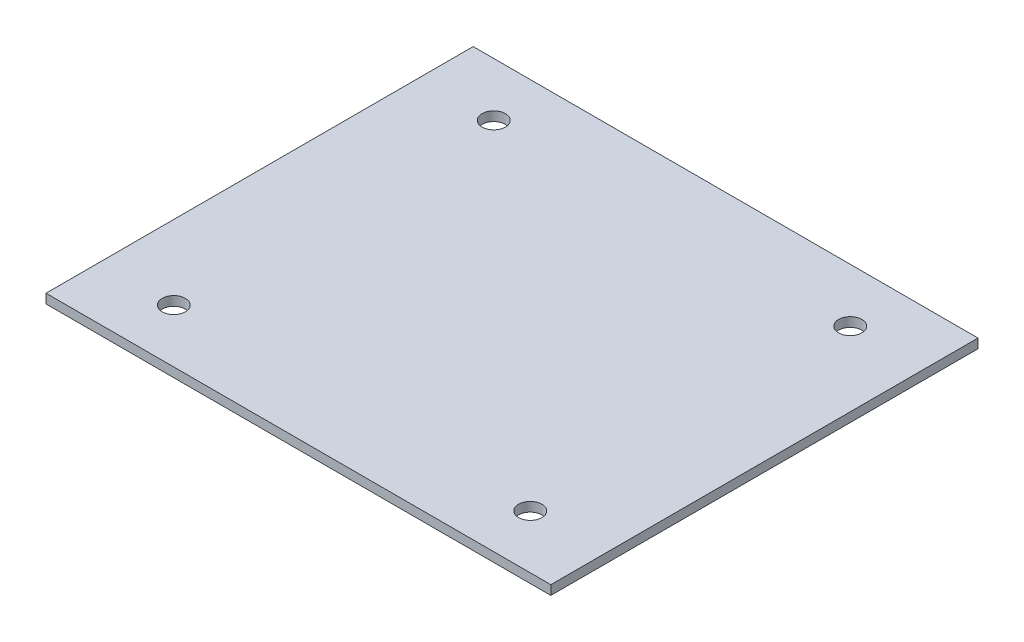
ISO-10303-21;
HEADER;
FILE_DESCRIPTION(('STEP AP214'),'2;1');
FILE_NAME('part.step','',(''),(''),'','','');
FILE_SCHEMA(('AUTOMOTIVE_DESIGN { 1 0 10303 214 1 1 1 1 }'));
ENDSEC;
DATA;
#1=APPLICATION_CONTEXT('core data for automotive mechanical design processes');
#2=APPLICATION_PROTOCOL_DEFINITION('international standard','automotive_design',2000,#1);
#3=PRODUCT_CONTEXT('',#1,'mechanical');
#4=PRODUCT('Part','Part','',(#3));
#5=PRODUCT_RELATED_PRODUCT_CATEGORY('part','',(#4));
#6=PRODUCT_DEFINITION_FORMATION('','',#4);
#7=PRODUCT_DEFINITION_CONTEXT('part definition',#1,'design');
#8=PRODUCT_DEFINITION('design','',#6,#7);
#9=PRODUCT_DEFINITION_SHAPE('','',#8);
#10=(LENGTH_UNIT() NAMED_UNIT(*) SI_UNIT(.MILLI.,.METRE.));
#11=(NAMED_UNIT(*) PLANE_ANGLE_UNIT() SI_UNIT($,.RADIAN.));
#12=(NAMED_UNIT(*) SI_UNIT($,.STERADIAN.) SOLID_ANGLE_UNIT());
#13=UNCERTAINTY_MEASURE_WITH_UNIT(LENGTH_MEASURE(1.E-05),#10,'distance_accuracy_value','');
#14=(GEOMETRIC_REPRESENTATION_CONTEXT(3) GLOBAL_UNCERTAINTY_ASSIGNED_CONTEXT((#13)) GLOBAL_UNIT_ASSIGNED_CONTEXT((#10,
#11,#12)) REPRESENTATION_CONTEXT('',''));
#15=CARTESIAN_POINT('',(0.,0.,0.));
#16=DIRECTION('',(0.,0.,1.));
#17=DIRECTION('',(1.,0.,0.));
#18=AXIS2_PLACEMENT_3D('',#15,#16,#17);
#19=CARTESIAN_POINT('',(0.,1.2,0.));
#20=DIRECTION('',(0.,1.,0.));
#21=DIRECTION('',(0.,0.,1.));
#22=AXIS2_PLACEMENT_3D('',#19,#20,#21);
#23=PLANE('',#22);
#24=CARTESIAN_POINT('',(22.95,1.2,20.6));
#25=DIRECTION('',(0.,1.,0.));
#26=DIRECTION('',(0.,0.,-1.));
#27=AXIS2_PLACEMENT_3D('',#24,#25,#26);
#28=CIRCLE('',#27,1.5);
#29=CARTESIAN_POINT('',(22.95,1.2,19.1));
#30=VERTEX_POINT('',#29);
#31=EDGE_CURVE('E142',#30,#30,#28,.T.);
#32=ORIENTED_EDGE('',*,*,#31,.F.);
#33=EDGE_LOOP('',(#32));
#34=FACE_BOUND('',#33,.T.);
#35=CARTESIAN_POINT('',(-22.95,1.2,-20.6));
#36=DIRECTION('',(0.,1.,0.));
#37=DIRECTION('',(0.,0.,1.));
#38=AXIS2_PLACEMENT_3D('',#35,#36,#37);
#39=CIRCLE('',#38,1.5);
#40=CARTESIAN_POINT('',(-22.95,1.2,-19.1));
#41=VERTEX_POINT('',#40);
#42=EDGE_CURVE('E112',#41,#41,#39,.T.);
#43=ORIENTED_EDGE('',*,*,#42,.F.);
#44=EDGE_LOOP('',(#43));
#45=FACE_BOUND('',#44,.T.);
#46=DIRECTION('',(-1.,0.,0.));
#47=VECTOR('',#46,1.);
#48=CARTESIAN_POINT('',(32.5,1.2,-27.5));
#49=LINE('',#48,#47);
#50=CARTESIAN_POINT('',(32.5,1.2,-27.5));
#51=VERTEX_POINT('',#50);
#52=CARTESIAN_POINT('',(-32.5,1.2,-27.5));
#53=VERTEX_POINT('',#52);
#54=EDGE_CURVE('E92',#51,#53,#49,.T.);
#55=ORIENTED_EDGE('',*,*,#54,.T.);
#56=DIRECTION('',(0.,0.,1.));
#57=VECTOR('',#56,1.);
#58=CARTESIAN_POINT('',(-32.5,1.2,-27.5));
#59=LINE('',#58,#57);
#60=CARTESIAN_POINT('',(-32.5,1.2,27.5));
#61=VERTEX_POINT('',#60);
#62=EDGE_CURVE('E87',#53,#61,#59,.T.);
#63=ORIENTED_EDGE('',*,*,#62,.T.);
#64=DIRECTION('',(1.,0.,0.));
#65=VECTOR('',#64,1.);
#66=CARTESIAN_POINT('',(-32.5,1.2,27.5));
#67=LINE('',#66,#65);
#68=CARTESIAN_POINT('',(32.5,1.2,27.5));
#69=VERTEX_POINT('',#68);
#70=EDGE_CURVE('E90',#61,#69,#67,.T.);
#71=ORIENTED_EDGE('',*,*,#70,.T.);
#72=DIRECTION('',(0.,0.,-1.));
#73=VECTOR('',#72,1.);
#74=CARTESIAN_POINT('',(32.5,1.2,27.5));
#75=LINE('',#74,#73);
#76=EDGE_CURVE('E57',#69,#51,#75,.T.);
#77=ORIENTED_EDGE('',*,*,#76,.T.);
#78=EDGE_LOOP('',(#55,#63,#71,#77));
#79=FACE_BOUND('',#78,.T.);
#80=CARTESIAN_POINT('',(-22.95,1.2,20.6));
#81=DIRECTION('',(0.,1.,0.));
#82=DIRECTION('',(0.,0.,1.));
#83=AXIS2_PLACEMENT_3D('',#80,#81,#82);
#84=CIRCLE('',#83,1.5);
#85=CARTESIAN_POINT('',(-22.95,1.2,22.1));
#86=VERTEX_POINT('',#85);
#87=EDGE_CURVE('E134',#86,#86,#84,.T.);
#88=ORIENTED_EDGE('',*,*,#87,.F.);
#89=EDGE_LOOP('',(#88));
#90=FACE_BOUND('',#89,.T.);
#91=CARTESIAN_POINT('',(22.95,1.2,-20.6));
#92=DIRECTION('',(0.,1.,0.));
#93=DIRECTION('',(0.,0.,-1.));
#94=AXIS2_PLACEMENT_3D('',#91,#92,#93);
#95=CIRCLE('',#94,1.5);
#96=CARTESIAN_POINT('',(22.95,1.2,-22.1));
#97=VERTEX_POINT('',#96);
#98=EDGE_CURVE('E150',#97,#97,#95,.T.);
#99=ORIENTED_EDGE('',*,*,#98,.F.);
#100=EDGE_LOOP('',(#99));
#101=FACE_BOUND('',#100,.T.);
#102=ADVANCED_FACE('F39',(#34,#45,#79,#90,#101),#23,.T.);
#103=CARTESIAN_POINT('',(0.,0.,0.));
#104=DIRECTION('',(0.,1.,0.));
#105=DIRECTION('',(0.,0.,1.));
#106=AXIS2_PLACEMENT_3D('',#103,#104,#105);
#107=PLANE('',#106);
#108=DIRECTION('',(-1.,0.,0.));
#109=VECTOR('',#108,1.);
#110=CARTESIAN_POINT('',(32.5,0.,-27.5));
#111=LINE('',#110,#109);
#112=CARTESIAN_POINT('',(32.5,0.,-27.5));
#113=VERTEX_POINT('',#112);
#114=CARTESIAN_POINT('',(-32.5,0.,-27.5));
#115=VERTEX_POINT('',#114);
#116=EDGE_CURVE('E108',#113,#115,#111,.T.);
#117=ORIENTED_EDGE('',*,*,#116,.F.);
#118=DIRECTION('',(0.,0.,-1.));
#119=VECTOR('',#118,1.);
#120=CARTESIAN_POINT('',(32.5,0.,27.5));
#121=LINE('',#120,#119);
#122=CARTESIAN_POINT('',(32.5,0.,27.5));
#123=VERTEX_POINT('',#122);
#124=EDGE_CURVE('E80',#123,#113,#121,.T.);
#125=ORIENTED_EDGE('',*,*,#124,.F.);
#126=DIRECTION('',(1.,0.,0.));
#127=VECTOR('',#126,1.);
#128=CARTESIAN_POINT('',(-32.5,0.,27.5));
#129=LINE('',#128,#127);
#130=CARTESIAN_POINT('',(-32.5,0.,27.5));
#131=VERTEX_POINT('',#130);
#132=EDGE_CURVE('E74',#131,#123,#129,.T.);
#133=ORIENTED_EDGE('',*,*,#132,.F.);
#134=DIRECTION('',(0.,0.,1.));
#135=VECTOR('',#134,1.);
#136=CARTESIAN_POINT('',(-32.5,0.,-27.5));
#137=LINE('',#136,#135);
#138=EDGE_CURVE('E97',#115,#131,#137,.T.);
#139=ORIENTED_EDGE('',*,*,#138,.F.);
#140=EDGE_LOOP('',(#117,#125,#133,#139));
#141=FACE_BOUND('',#140,.T.);
#142=CARTESIAN_POINT('',(-22.95,0.,-20.6));
#143=DIRECTION('',(0.,1.,0.));
#144=DIRECTION('',(0.,0.,1.));
#145=AXIS2_PLACEMENT_3D('',#142,#143,#144);
#146=CIRCLE('',#145,1.5);
#147=CARTESIAN_POINT('',(-22.95,0.,-19.1));
#148=VERTEX_POINT('',#147);
#149=EDGE_CURVE('E130',#148,#148,#146,.T.);
#150=ORIENTED_EDGE('',*,*,#149,.T.);
#151=EDGE_LOOP('',(#150));
#152=FACE_BOUND('',#151,.T.);
#153=CARTESIAN_POINT('',(-22.95,0.,20.6));
#154=DIRECTION('',(0.,1.,0.));
#155=DIRECTION('',(0.,0.,1.));
#156=AXIS2_PLACEMENT_3D('',#153,#154,#155);
#157=CIRCLE('',#156,1.5);
#158=CARTESIAN_POINT('',(-22.95,0.,22.1));
#159=VERTEX_POINT('',#158);
#160=EDGE_CURVE('E138',#159,#159,#157,.T.);
#161=ORIENTED_EDGE('',*,*,#160,.T.);
#162=EDGE_LOOP('',(#161));
#163=FACE_BOUND('',#162,.T.);
#164=CARTESIAN_POINT('',(22.95,0.,20.6));
#165=DIRECTION('',(0.,1.,0.));
#166=DIRECTION('',(0.,0.,-1.));
#167=AXIS2_PLACEMENT_3D('',#164,#165,#166);
#168=CIRCLE('',#167,1.5);
#169=CARTESIAN_POINT('',(22.95,0.,19.1));
#170=VERTEX_POINT('',#169);
#171=EDGE_CURVE('E146',#170,#170,#168,.T.);
#172=ORIENTED_EDGE('',*,*,#171,.T.);
#173=EDGE_LOOP('',(#172));
#174=FACE_BOUND('',#173,.T.);
#175=CARTESIAN_POINT('',(22.95,0.,-20.6));
#176=DIRECTION('',(0.,1.,0.));
#177=DIRECTION('',(0.,0.,-1.));
#178=AXIS2_PLACEMENT_3D('',#175,#176,#177);
#179=CIRCLE('',#178,1.5);
#180=CARTESIAN_POINT('',(22.95,0.,-22.1));
#181=VERTEX_POINT('',#180);
#182=EDGE_CURVE('E154',#181,#181,#179,.T.);
#183=ORIENTED_EDGE('',*,*,#182,.T.);
#184=EDGE_LOOP('',(#183));
#185=FACE_BOUND('',#184,.T.);
#186=ADVANCED_FACE('F125',(#141,#152,#163,#174,#185),#107,.F.);
#187=CARTESIAN_POINT('',(32.5,1.2,-27.5));
#188=DIRECTION('',(0.,0.,1.));
#189=DIRECTION('',(1.,0.,0.));
#190=AXIS2_PLACEMENT_3D('',#187,#188,#189);
#191=PLANE('',#190);
#192=ORIENTED_EDGE('',*,*,#116,.T.);
#193=DIRECTION('',(0.,-1.,0.));
#194=VECTOR('',#193,1.);
#195=CARTESIAN_POINT('',(-32.5,1.2,-27.5));
#196=LINE('',#195,#194);
#197=EDGE_CURVE('E11',#53,#115,#196,.T.);
#198=ORIENTED_EDGE('',*,*,#197,.F.);
#199=ORIENTED_EDGE('',*,*,#54,.F.);
#200=DIRECTION('',(0.,-1.,0.));
#201=VECTOR('',#200,1.);
#202=CARTESIAN_POINT('',(32.5,1.2,-27.5));
#203=LINE('',#202,#201);
#204=EDGE_CURVE('E104',#51,#113,#203,.T.);
#205=ORIENTED_EDGE('',*,*,#204,.T.);
#206=EDGE_LOOP('',(#192,#198,#199,#205));
#207=FACE_BOUND('',#206,.T.);
#208=ADVANCED_FACE('F41',(#207),#191,.F.);
#209=CARTESIAN_POINT('',(-32.5,1.2,-27.5));
#210=DIRECTION('',(1.,0.,0.));
#211=DIRECTION('',(0.,0.,-1.));
#212=AXIS2_PLACEMENT_3D('',#209,#210,#211);
#213=PLANE('',#212);
#214=ORIENTED_EDGE('',*,*,#138,.T.);
#215=DIRECTION('',(0.,-1.,0.));
#216=VECTOR('',#215,1.);
#217=CARTESIAN_POINT('',(-32.5,1.2,27.5));
#218=LINE('',#217,#216);
#219=EDGE_CURVE('E49',#61,#131,#218,.T.);
#220=ORIENTED_EDGE('',*,*,#219,.F.);
#221=ORIENTED_EDGE('',*,*,#62,.F.);
#222=ORIENTED_EDGE('',*,*,#197,.T.);
#223=EDGE_LOOP('',(#214,#220,#221,#222));
#224=FACE_BOUND('',#223,.T.);
#225=ADVANCED_FACE('F96',(#224),#213,.F.);
#226=CARTESIAN_POINT('',(-32.5,1.2,27.5));
#227=DIRECTION('',(0.,0.,-1.));
#228=DIRECTION('',(-1.,0.,0.));
#229=AXIS2_PLACEMENT_3D('',#226,#227,#228);
#230=PLANE('',#229);
#231=ORIENTED_EDGE('',*,*,#132,.T.);
#232=DIRECTION('',(0.,-1.,0.));
#233=VECTOR('',#232,1.);
#234=CARTESIAN_POINT('',(32.5,1.2,27.5));
#235=LINE('',#234,#233);
#236=EDGE_CURVE('E99',#69,#123,#235,.T.);
#237=ORIENTED_EDGE('',*,*,#236,.F.);
#238=ORIENTED_EDGE('',*,*,#70,.F.);
#239=ORIENTED_EDGE('',*,*,#219,.T.);
#240=EDGE_LOOP('',(#231,#237,#238,#239));
#241=FACE_BOUND('',#240,.T.);
#242=ADVANCED_FACE('F100',(#241),#230,.F.);
#243=CARTESIAN_POINT('',(32.5,1.2,27.5));
#244=DIRECTION('',(-1.,0.,0.));
#245=DIRECTION('',(0.,0.,1.));
#246=AXIS2_PLACEMENT_3D('',#243,#244,#245);
#247=PLANE('',#246);
#248=ORIENTED_EDGE('',*,*,#124,.T.);
#249=ORIENTED_EDGE('',*,*,#204,.F.);
#250=ORIENTED_EDGE('',*,*,#76,.F.);
#251=ORIENTED_EDGE('',*,*,#236,.T.);
#252=EDGE_LOOP('',(#248,#249,#250,#251));
#253=FACE_BOUND('',#252,.T.);
#254=ADVANCED_FACE('F122',(#253),#247,.F.);
#255=CARTESIAN_POINT('',(-22.95,1.2,-20.6));
#256=DIRECTION('',(0.,-1.,0.));
#257=DIRECTION('',(0.,0.,-1.));
#258=AXIS2_PLACEMENT_3D('',#255,#256,#257);
#259=CYLINDRICAL_SURFACE('',#258,1.5);
#260=ORIENTED_EDGE('',*,*,#42,.T.);
#261=EDGE_LOOP('',(#260));
#262=FACE_BOUND('',#261,.T.);
#263=ORIENTED_EDGE('',*,*,#149,.F.);
#264=EDGE_LOOP('',(#263));
#265=FACE_BOUND('',#264,.T.);
#266=ADVANCED_FACE('F175',(#262,#265),#259,.F.);
#267=CARTESIAN_POINT('',(-22.95,1.2,20.6));
#268=DIRECTION('',(0.,-1.,0.));
#269=DIRECTION('',(0.,0.,-1.));
#270=AXIS2_PLACEMENT_3D('',#267,#268,#269);
#271=CYLINDRICAL_SURFACE('',#270,1.5);
#272=ORIENTED_EDGE('',*,*,#87,.T.);
#273=EDGE_LOOP('',(#272));
#274=FACE_BOUND('',#273,.T.);
#275=ORIENTED_EDGE('',*,*,#160,.F.);
#276=EDGE_LOOP('',(#275));
#277=FACE_BOUND('',#276,.T.);
#278=ADVANCED_FACE('F221',(#274,#277),#271,.F.);
#279=CARTESIAN_POINT('',(22.95,1.2,20.6));
#280=DIRECTION('',(0.,-1.,0.));
#281=DIRECTION('',(0.,0.,-1.));
#282=AXIS2_PLACEMENT_3D('',#279,#280,#281);
#283=CYLINDRICAL_SURFACE('',#282,1.5);
#284=ORIENTED_EDGE('',*,*,#31,.T.);
#285=EDGE_LOOP('',(#284));
#286=FACE_BOUND('',#285,.T.);
#287=ORIENTED_EDGE('',*,*,#171,.F.);
#288=EDGE_LOOP('',(#287));
#289=FACE_BOUND('',#288,.T.);
#290=ADVANCED_FACE('F229',(#286,#289),#283,.F.);
#291=CARTESIAN_POINT('',(22.95,1.2,-20.6));
#292=DIRECTION('',(0.,-1.,0.));
#293=DIRECTION('',(0.,0.,-1.));
#294=AXIS2_PLACEMENT_3D('',#291,#292,#293);
#295=CYLINDRICAL_SURFACE('',#294,1.5);
#296=ORIENTED_EDGE('',*,*,#98,.T.);
#297=EDGE_LOOP('',(#296));
#298=FACE_BOUND('',#297,.T.);
#299=ORIENTED_EDGE('',*,*,#182,.F.);
#300=EDGE_LOOP('',(#299));
#301=FACE_BOUND('',#300,.T.);
#302=ADVANCED_FACE('F162',(#298,#301),#295,.F.);
#303=CLOSED_SHELL('',(#102,#186,#208,#225,#242,#254,#266,#278,#290,#302));
#304=MANIFOLD_SOLID_BREP('B2',#303);
#305=ADVANCED_BREP_SHAPE_REPRESENTATION('',(#18,#304),#14);
#306=SHAPE_DEFINITION_REPRESENTATION(#9,#305);
ENDSEC;
END-ISO-10303-21;
